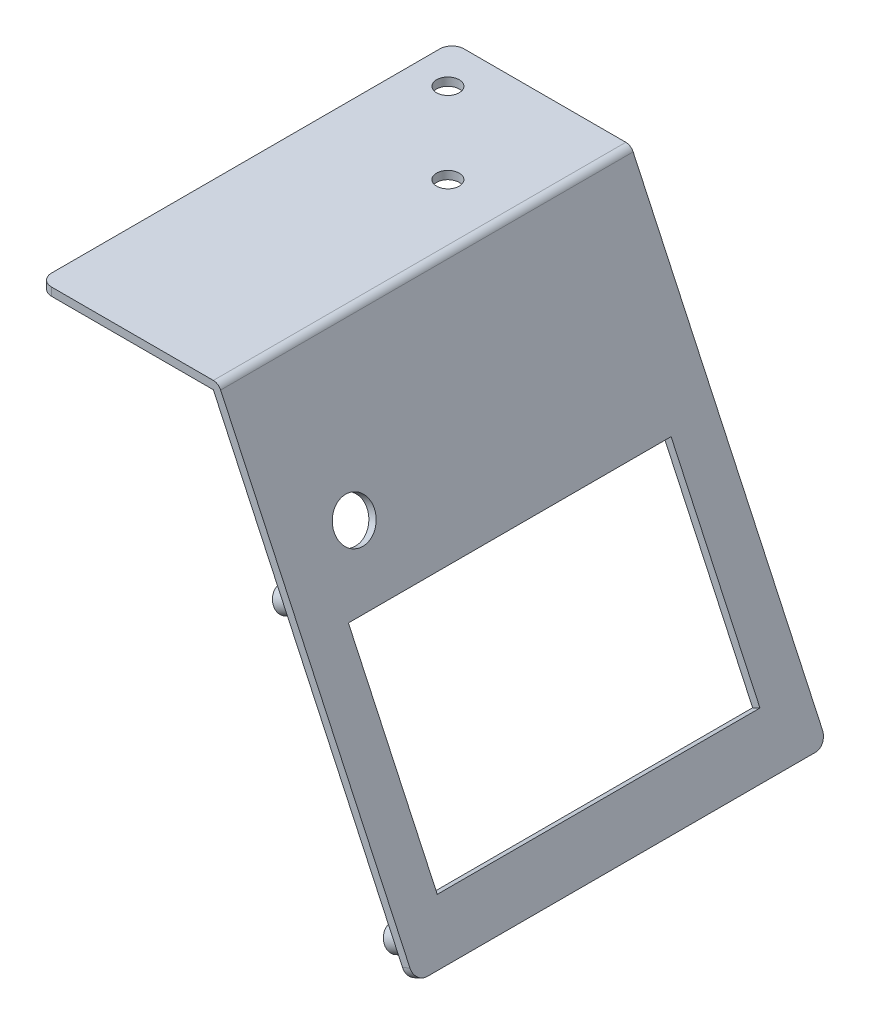
ISO-10303-21;
HEADER;
FILE_DESCRIPTION(('STEP AP214'),'2;1');
FILE_NAME('part.step','',(''),(''),'','','');
FILE_SCHEMA(('AUTOMOTIVE_DESIGN { 1 0 10303 214 1 1 1 1 }'));
ENDSEC;
DATA;
#1=APPLICATION_CONTEXT('core data for automotive mechanical design processes');
#2=APPLICATION_PROTOCOL_DEFINITION('international standard','automotive_design',2000,#1);
#3=PRODUCT_CONTEXT('',#1,'mechanical');
#4=PRODUCT('Part','Part','',(#3));
#5=PRODUCT_RELATED_PRODUCT_CATEGORY('part','',(#4));
#6=PRODUCT_DEFINITION_FORMATION('','',#4);
#7=PRODUCT_DEFINITION_CONTEXT('part definition',#1,'design');
#8=PRODUCT_DEFINITION('design','',#6,#7);
#9=PRODUCT_DEFINITION_SHAPE('','',#8);
#10=(LENGTH_UNIT() NAMED_UNIT(*) SI_UNIT(.MILLI.,.METRE.));
#11=(NAMED_UNIT(*) PLANE_ANGLE_UNIT() SI_UNIT($,.RADIAN.));
#12=(NAMED_UNIT(*) SI_UNIT($,.STERADIAN.) SOLID_ANGLE_UNIT());
#13=UNCERTAINTY_MEASURE_WITH_UNIT(LENGTH_MEASURE(1.E-05),#10,'distance_accuracy_value','');
#14=(GEOMETRIC_REPRESENTATION_CONTEXT(3) GLOBAL_UNCERTAINTY_ASSIGNED_CONTEXT((#13)) GLOBAL_UNIT_ASSIGNED_CONTEXT((#10,
#11,#12)) REPRESENTATION_CONTEXT('',''));
#15=CARTESIAN_POINT('',(0.,0.,0.));
#16=DIRECTION('',(0.,0.,1.));
#17=DIRECTION('',(1.,0.,0.));
#18=AXIS2_PLACEMENT_3D('',#15,#16,#17);
#19=CARTESIAN_POINT('',(92.8752406217959,-104.225395509215,102.));
#20=DIRECTION('',(0.422618261740697,-0.906307787036651,0.));
#21=DIRECTION('',(0.906307787036651,0.422618261740697,0.));
#22=AXIS2_PLACEMENT_3D('',#19,#20,#21);
#23=PLANE('',#22);
#24=DIRECTION('',(0.,0.,-1.));
#25=VECTOR('',#24,1.);
#26=CARTESIAN_POINT('',(92.8752406217959,-104.225395509215,102.));
#27=LINE('',#26,#25);
#28=CARTESIAN_POINT('',(92.8752406217959,-104.225395509215,99.));
#29=VERTEX_POINT('',#28);
#30=CARTESIAN_POINT('',(92.8752406217959,-104.225395509215,3.));
#31=VERTEX_POINT('',#30);
#32=EDGE_CURVE('E196',#29,#31,#27,.T.);
#33=ORIENTED_EDGE('',*,*,#32,.F.);
#34=DIRECTION('',(-0.906307787036651,-0.422618261740697,0.));
#35=VECTOR('',#34,1.);
#36=CARTESIAN_POINT('',(91.0626250477226,-105.070632032696,99.));
#37=LINE('',#36,#35);
#38=CARTESIAN_POINT('',(91.0626250477226,-105.070632032696,99.));
#39=VERTEX_POINT('',#38);
#40=EDGE_CURVE('E239',#29,#39,#37,.T.);
#41=ORIENTED_EDGE('',*,*,#40,.T.);
#42=DIRECTION('',(0.,0.,-1.));
#43=VECTOR('',#42,1.);
#44=CARTESIAN_POINT('',(91.0626250477226,-105.070632032696,102.));
#45=LINE('',#44,#43);
#46=CARTESIAN_POINT('',(91.0626250477226,-105.070632032696,3.));
#47=VERTEX_POINT('',#46);
#48=EDGE_CURVE('E187',#39,#47,#45,.T.);
#49=ORIENTED_EDGE('',*,*,#48,.T.);
#50=DIRECTION('',(-0.906307787036651,-0.422618261740697,0.));
#51=VECTOR('',#50,1.);
#52=CARTESIAN_POINT('',(92.8752406217959,-104.225395509215,3.));
#53=LINE('',#52,#51);
#54=EDGE_CURVE('E237',#47,#31,#53,.F.);
#55=ORIENTED_EDGE('',*,*,#54,.T.);
#56=EDGE_LOOP('',(#33,#41,#49,#55));
#57=FACE_BOUND('',#56,.T.);
#58=ADVANCED_FACE('F34',(#57),#23,.T.);
#59=CARTESIAN_POINT('',(44.2741405216157,3.70279042205781E-13,102.));
#60=DIRECTION('',(0.906307787036651,0.422618261740697,0.));
#61=DIRECTION('',(-0.422618261740697,0.906307787036651,0.));
#62=AXIS2_PLACEMENT_3D('',#59,#60,#61);
#63=PLANE('',#62);
#64=CARTESIAN_POINT('',(58.9366830246469,-31.4439238700159,83.1));
#65=DIRECTION('',(0.906307787036651,0.422618261740697,0.));
#66=DIRECTION('',(-0.422618261740697,0.906307787036651,0.));
#67=AXIS2_PLACEMENT_3D('',#64,#65,#66);
#68=CIRCLE('',#67,4.99999999999998);
#69=CARTESIAN_POINT('',(56.8235917159435,-26.9123849348326,83.1));
#70=VERTEX_POINT('',#69);
#71=EDGE_CURVE('E375',#70,#70,#68,.T.);
#72=ORIENTED_EDGE('',*,*,#71,.F.);
#73=EDGE_LOOP('',(#72));
#74=FACE_BOUND('',#73,.T.);
#75=DIRECTION('',(-0.422618261740704,0.906307787036648,0.));
#76=VECTOR('',#75,1.);
#77=CARTESIAN_POINT('',(87.6747248230152,-93.0728533885078,11.5000000000001));
#78=LINE('',#77,#76);
#79=CARTESIAN_POINT('',(87.6747248230152,-93.0728533885078,11.5000000000001));
#80=VERTEX_POINT('',#79);
#81=CARTESIAN_POINT('',(65.6985752124981,-45.9448484626023,11.5000000000001));
#82=VERTEX_POINT('',#81);
#83=EDGE_CURVE('E162',#80,#82,#78,.T.);
#84=ORIENTED_EDGE('',*,*,#83,.F.);
#85=DIRECTION('',(0.,0.,-1.));
#86=VECTOR('',#85,1.);
#87=CARTESIAN_POINT('',(87.6747248230152,-93.0728533885077,91.3));
#88=LINE('',#87,#86);
#89=CARTESIAN_POINT('',(87.6747248230152,-93.0728533885077,91.3));
#90=VERTEX_POINT('',#89);
#91=EDGE_CURVE('E167',#90,#80,#88,.T.);
#92=ORIENTED_EDGE('',*,*,#91,.F.);
#93=DIRECTION('',(0.422618261740704,-0.906307787036648,0.));
#94=VECTOR('',#93,1.);
#95=CARTESIAN_POINT('',(65.6985752124986,-45.944848462602,91.3));
#96=LINE('',#95,#94);
#97=CARTESIAN_POINT('',(65.6985752124986,-45.944848462602,91.3));
#98=VERTEX_POINT('',#97);
#99=EDGE_CURVE('E146',#98,#90,#96,.T.);
#100=ORIENTED_EDGE('',*,*,#99,.F.);
#101=DIRECTION('',(0.,0.,1.));
#102=VECTOR('',#101,1.);
#103=CARTESIAN_POINT('',(65.6985752124986,-45.944848462602,11.5000000000001));
#104=LINE('',#103,#102);
#105=EDGE_CURVE('E157',#82,#98,#104,.T.);
#106=ORIENTED_EDGE('',*,*,#105,.F.);
#107=EDGE_LOOP('',(#84,#92,#100,#106));
#108=FACE_BOUND('',#107,.T.);
#109=DIRECTION('',(0.422618261740697,-0.906307787036651,0.));
#110=VECTOR('',#109,1.);
#111=CARTESIAN_POINT('',(44.2741405216157,3.70279042205781E-13,102.));
#112=LINE('',#111,#110);
#113=CARTESIAN_POINT('',(44.812615574074,-1.15476347651825,102.));
#114=VERTEX_POINT('',#113);
#115=CARTESIAN_POINT('',(91.6073858365738,-101.506472148105,102.));
#116=VERTEX_POINT('',#115);
#117=EDGE_CURVE('E184',#114,#116,#112,.T.);
#118=ORIENTED_EDGE('',*,*,#117,.T.);
#119=CARTESIAN_POINT('',(91.6073858365738,-101.506472148105,99.));
#120=DIRECTION('',(0.906307787036651,0.422618261740697,0.));
#121=DIRECTION('',(-0.422618261740697,0.906307787036651,0.));
#122=AXIS2_PLACEMENT_3D('',#119,#120,#121);
#123=CIRCLE('',#122,3.);
#124=EDGE_CURVE('E252',#116,#29,#123,.T.);
#125=ORIENTED_EDGE('',*,*,#124,.T.);
#126=ORIENTED_EDGE('',*,*,#32,.T.);
#127=CARTESIAN_POINT('',(91.6073858365738,-101.506472148105,3.));
#128=DIRECTION('',(0.906307787036651,0.422618261740697,0.));
#129=DIRECTION('',(-0.422618261740697,0.906307787036651,0.));
#130=AXIS2_PLACEMENT_3D('',#127,#128,#129);
#131=CIRCLE('',#130,3.);
#132=CARTESIAN_POINT('',(91.6073858365738,-101.506472148105,0.));
#133=VERTEX_POINT('',#132);
#134=EDGE_CURVE('E250',#31,#133,#131,.T.);
#135=ORIENTED_EDGE('',*,*,#134,.T.);
#136=DIRECTION('',(0.422618261740697,-0.906307787036651,0.));
#137=VECTOR('',#136,1.);
#138=CARTESIAN_POINT('',(44.2741405216157,3.70279042205781E-13,0.));
#139=LINE('',#138,#137);
#140=CARTESIAN_POINT('',(44.812615574074,-1.15476347651825,0.));
#141=VERTEX_POINT('',#140);
#142=EDGE_CURVE('E180',#141,#133,#139,.T.);
#143=ORIENTED_EDGE('',*,*,#142,.F.);
#144=DIRECTION('',(0.,0.,-1.));
#145=VECTOR('',#144,1.);
#146=CARTESIAN_POINT('',(44.812615574074,-1.15476347651825,102.));
#147=LINE('',#146,#145);
#148=EDGE_CURVE('E232',#141,#114,#147,.F.);
#149=ORIENTED_EDGE('',*,*,#148,.T.);
#150=EDGE_LOOP('',(#118,#125,#126,#135,#143,#149));
#151=FACE_BOUND('',#150,.T.);
#152=ADVANCED_FACE('F164',(#74,#108,#151),#63,.T.);
#153=CARTESIAN_POINT('',(0.,0.,102.));
#154=DIRECTION('',(0.,1.,0.));
#155=DIRECTION('',(-1.,0.,0.));
#156=AXIS2_PLACEMENT_3D('',#153,#154,#155);
#157=PLANE('',#156);
#158=CARTESIAN_POINT('',(28.9999999999989,0.,29.9999999999999));
#159=DIRECTION('',(0.,-1.,0.));
#160=DIRECTION('',(0.,0.,-1.));
#161=AXIS2_PLACEMENT_3D('',#158,#159,#160);
#162=CIRCLE('',#161,2.80000000000105);
#163=CARTESIAN_POINT('',(28.9999999999989,0.,27.1999999999988));
#164=VERTEX_POINT('',#163);
#165=EDGE_CURVE('E385',#164,#164,#162,.T.);
#166=ORIENTED_EDGE('',*,*,#165,.T.);
#167=EDGE_LOOP('',(#166));
#168=FACE_BOUND('',#167,.T.);
#169=CARTESIAN_POINT('',(8.9999999999989,0.,9.99999999999991));
#170=DIRECTION('',(0.,-1.,0.));
#171=DIRECTION('',(0.,0.,-1.));
#172=AXIS2_PLACEMENT_3D('',#169,#170,#171);
#173=CIRCLE('',#172,2.80000000000105);
#174=CARTESIAN_POINT('',(8.9999999999989,0.,7.19999999999886));
#175=VERTEX_POINT('',#174);
#176=EDGE_CURVE('E379',#175,#175,#173,.T.);
#177=ORIENTED_EDGE('',*,*,#176,.T.);
#178=EDGE_LOOP('',(#177));
#179=FACE_BOUND('',#178,.T.);
#180=DIRECTION('',(1.,0.,0.));
#181=VECTOR('',#180,1.);
#182=CARTESIAN_POINT('',(0.,0.,0.));
#183=LINE('',#182,#181);
#184=CARTESIAN_POINT('',(3.,0.,0.));
#185=VERTEX_POINT('',#184);
#186=CARTESIAN_POINT('',(43.0000000000007,3.59622990469467E-13,0.));
#187=VERTEX_POINT('',#186);
#188=EDGE_CURVE('E192',#185,#187,#183,.T.);
#189=ORIENTED_EDGE('',*,*,#188,.F.);
#190=CARTESIAN_POINT('',(3.,0.,3.));
#191=DIRECTION('',(0.,1.,0.));
#192=DIRECTION('',(-1.,0.,0.));
#193=AXIS2_PLACEMENT_3D('',#190,#191,#192);
#194=CIRCLE('',#193,3.);
#195=CARTESIAN_POINT('',(0.,0.,3.));
#196=VERTEX_POINT('',#195);
#197=EDGE_CURVE('E262',#185,#196,#194,.T.);
#198=ORIENTED_EDGE('',*,*,#197,.T.);
#199=DIRECTION('',(0.,0.,-1.));
#200=VECTOR('',#199,1.);
#201=CARTESIAN_POINT('',(0.,0.,102.));
#202=LINE('',#201,#200);
#203=CARTESIAN_POINT('',(0.,0.,99.));
#204=VERTEX_POINT('',#203);
#205=EDGE_CURVE('E200',#204,#196,#202,.T.);
#206=ORIENTED_EDGE('',*,*,#205,.F.);
#207=CARTESIAN_POINT('',(3.,0.,99.));
#208=DIRECTION('',(0.,1.,0.));
#209=DIRECTION('',(-1.,0.,0.));
#210=AXIS2_PLACEMENT_3D('',#207,#208,#209);
#211=CIRCLE('',#210,3.);
#212=CARTESIAN_POINT('',(3.,0.,102.));
#213=VERTEX_POINT('',#212);
#214=EDGE_CURVE('E260',#204,#213,#211,.T.);
#215=ORIENTED_EDGE('',*,*,#214,.T.);
#216=DIRECTION('',(1.,0.,0.));
#217=VECTOR('',#216,1.);
#218=CARTESIAN_POINT('',(0.,0.,102.));
#219=LINE('',#218,#217);
#220=CARTESIAN_POINT('',(43.0000000000007,3.59622990469467E-13,102.));
#221=VERTEX_POINT('',#220);
#222=EDGE_CURVE('E182',#213,#221,#219,.T.);
#223=ORIENTED_EDGE('',*,*,#222,.T.);
#224=DIRECTION('',(0.,0.,-1.));
#225=VECTOR('',#224,1.);
#226=CARTESIAN_POINT('',(43.0000000000007,3.59622990469467E-13,102.));
#227=LINE('',#226,#225);
#228=EDGE_CURVE('E227',#221,#187,#227,.T.);
#229=ORIENTED_EDGE('',*,*,#228,.T.);
#230=EDGE_LOOP('',(#189,#198,#206,#215,#223,#229));
#231=FACE_BOUND('',#230,.T.);
#232=ADVANCED_FACE('F273',(#168,#179,#231),#157,.T.);
#233=CARTESIAN_POINT('',(0.,-2.,102.));
#234=DIRECTION('',(-1.,0.,0.));
#235=DIRECTION('',(0.,0.,1.));
#236=AXIS2_PLACEMENT_3D('',#233,#234,#235);
#237=PLANE('',#236);
#238=ORIENTED_EDGE('',*,*,#205,.T.);
#239=DIRECTION('',(0.,1.,0.));
#240=VECTOR('',#239,1.);
#241=CARTESIAN_POINT('',(0.,-2.,3.));
#242=LINE('',#241,#240);
#243=CARTESIAN_POINT('',(0.,-2.,3.));
#244=VERTEX_POINT('',#243);
#245=EDGE_CURVE('E49',#196,#244,#242,.F.);
#246=ORIENTED_EDGE('',*,*,#245,.T.);
#247=DIRECTION('',(0.,0.,-1.));
#248=VECTOR('',#247,1.);
#249=CARTESIAN_POINT('',(0.,-2.,102.));
#250=LINE('',#249,#248);
#251=CARTESIAN_POINT('',(0.,-2.,99.));
#252=VERTEX_POINT('',#251);
#253=EDGE_CURVE('E202',#252,#244,#250,.T.);
#254=ORIENTED_EDGE('',*,*,#253,.F.);
#255=DIRECTION('',(0.,1.,0.));
#256=VECTOR('',#255,1.);
#257=CARTESIAN_POINT('',(0.,0.,99.));
#258=LINE('',#257,#256);
#259=EDGE_CURVE('E264',#252,#204,#258,.T.);
#260=ORIENTED_EDGE('',*,*,#259,.T.);
#261=EDGE_LOOP('',(#238,#246,#254,#260));
#262=FACE_BOUND('',#261,.T.);
#263=ADVANCED_FACE('F269',(#262),#237,.T.);
#264=CARTESIAN_POINT('',(43.0000000000008,-1.99999999999965,102.));
#265=DIRECTION('',(0.,-1.,0.));
#266=DIRECTION('',(1.,0.,0.));
#267=AXIS2_PLACEMENT_3D('',#264,#265,#266);
#268=PLANE('',#267);
#269=CARTESIAN_POINT('',(28.9999999999989,-2.,29.9999999999999));
#270=DIRECTION('',(0.,-1.,0.));
#271=DIRECTION('',(0.,0.,-1.));
#272=AXIS2_PLACEMENT_3D('',#269,#270,#271);
#273=CIRCLE('',#272,2.80000000000105);
#274=CARTESIAN_POINT('',(28.9999999999989,-2.,27.1999999999988));
#275=VERTEX_POINT('',#274);
#276=EDGE_CURVE('E388',#275,#275,#273,.T.);
#277=ORIENTED_EDGE('',*,*,#276,.F.);
#278=EDGE_LOOP('',(#277));
#279=FACE_BOUND('',#278,.T.);
#280=CARTESIAN_POINT('',(8.9999999999989,-2.,9.99999999999991));
#281=DIRECTION('',(0.,-1.,0.));
#282=DIRECTION('',(0.,0.,-1.));
#283=AXIS2_PLACEMENT_3D('',#280,#281,#282);
#284=CIRCLE('',#283,2.80000000000105);
#285=CARTESIAN_POINT('',(8.9999999999989,-2.,7.19999999999886));
#286=VERTEX_POINT('',#285);
#287=EDGE_CURVE('E382',#286,#286,#284,.T.);
#288=ORIENTED_EDGE('',*,*,#287,.F.);
#289=EDGE_LOOP('',(#288));
#290=FACE_BOUND('',#289,.T.);
#291=ORIENTED_EDGE('',*,*,#253,.T.);
#292=CARTESIAN_POINT('',(3.,-1.99999999999998,3.));
#293=DIRECTION('',(0.,-1.,0.));
#294=DIRECTION('',(1.,0.,0.));
#295=AXIS2_PLACEMENT_3D('',#292,#293,#294);
#296=CIRCLE('',#295,3.);
#297=CARTESIAN_POINT('',(3.,-1.99999999999998,0.));
#298=VERTEX_POINT('',#297);
#299=EDGE_CURVE('E11',#244,#298,#296,.T.);
#300=ORIENTED_EDGE('',*,*,#299,.T.);
#301=DIRECTION('',(-1.,0.,0.));
#302=VECTOR('',#301,1.);
#303=CARTESIAN_POINT('',(43.0000000000008,-1.99999999999965,0.));
#304=LINE('',#303,#302);
#305=CARTESIAN_POINT('',(43.0000000000008,-1.99999999999965,0.));
#306=VERTEX_POINT('',#305);
#307=EDGE_CURVE('E189',#306,#298,#304,.T.);
#308=ORIENTED_EDGE('',*,*,#307,.F.);
#309=DIRECTION('',(0.,0.,-1.));
#310=VECTOR('',#309,1.);
#311=CARTESIAN_POINT('',(43.0000000000008,-1.99999999999965,102.));
#312=LINE('',#311,#310);
#313=CARTESIAN_POINT('',(43.0000000000008,-1.99999999999965,102.));
#314=VERTEX_POINT('',#313);
#315=EDGE_CURVE('E204',#314,#306,#312,.T.);
#316=ORIENTED_EDGE('',*,*,#315,.F.);
#317=DIRECTION('',(-1.,0.,0.));
#318=VECTOR('',#317,1.);
#319=CARTESIAN_POINT('',(43.0000000000008,-1.99999999999965,102.));
#320=LINE('',#319,#318);
#321=CARTESIAN_POINT('',(3.,-1.99999999999998,102.));
#322=VERTEX_POINT('',#321);
#323=EDGE_CURVE('E179',#314,#322,#320,.T.);
#324=ORIENTED_EDGE('',*,*,#323,.T.);
#325=CARTESIAN_POINT('',(3.,-1.99999999999998,99.));
#326=DIRECTION('',(0.,-1.,0.));
#327=DIRECTION('',(1.,0.,0.));
#328=AXIS2_PLACEMENT_3D('',#325,#326,#327);
#329=CIRCLE('',#328,3.);
#330=EDGE_CURVE('E42',#322,#252,#329,.T.);
#331=ORIENTED_EDGE('',*,*,#330,.T.);
#332=EDGE_LOOP('',(#291,#300,#308,#316,#324,#331));
#333=FACE_BOUND('',#332,.T.);
#334=ADVANCED_FACE('F285',(#279,#290,#333),#268,.T.);
#335=CARTESIAN_POINT('',(91.0626250477226,-105.070632032696,102.));
#336=DIRECTION('',(-0.906307787036651,-0.422618261740697,0.));
#337=DIRECTION('',(0.422618261740697,-0.906307787036651,0.));
#338=AXIS2_PLACEMENT_3D('',#335,#336,#337);
#339=PLANE('',#338);
#340=CARTESIAN_POINT('',(57.1240674505741,-32.2891603934971,83.1));
#341=DIRECTION('',(-0.906307787036648,-0.422618261740704,0.));
#342=DIRECTION('',(0.422618261740704,-0.906307787036648,0.));
#343=AXIS2_PLACEMENT_3D('',#340,#341,#342);
#344=CIRCLE('',#343,4.99999999999999);
#345=CARTESIAN_POINT('',(59.2371587592776,-36.8206993286803,83.1));
#346=VERTEX_POINT('',#345);
#347=EDGE_CURVE('E346',#346,#346,#344,.T.);
#348=ORIENTED_EDGE('',*,*,#347,.F.);
#349=EDGE_LOOP('',(#348));
#350=FACE_BOUND('',#349,.T.);
#351=CARTESIAN_POINT('',(61.1600718501972,-40.944399759697,8.04999999999999));
#352=DIRECTION('',(-0.906307787036651,-0.422618261740697,0.));
#353=DIRECTION('',(0.422618261740697,-0.906307787036651,0.));
#354=AXIS2_PLACEMENT_3D('',#351,#352,#353);
#355=CIRCLE('',#354,3.00000000000001);
#356=CARTESIAN_POINT('',(62.4279266354193,-43.6633231208069,8.04999999999999));
#357=VERTEX_POINT('',#356);
#358=EDGE_CURVE('E224',#357,#357,#355,.T.);
#359=ORIENTED_EDGE('',*,*,#358,.F.);
#360=EDGE_LOOP('',(#359));
#361=FACE_BOUND('',#360,.T.);
#362=CARTESIAN_POINT('',(88.5879970371684,-99.7637751383756,8.04999999999999));
#363=DIRECTION('',(-0.906307787036651,-0.422618261740697,0.));
#364=DIRECTION('',(0.422618261740697,-0.906307787036651,0.));
#365=AXIS2_PLACEMENT_3D('',#362,#363,#364);
#366=CIRCLE('',#365,2.99999999999999);
#367=CARTESIAN_POINT('',(87.3201422519463,-97.0448517772657,8.04999999999999));
#368=VERTEX_POINT('',#367);
#369=EDGE_CURVE('E221',#368,#368,#366,.T.);
#370=ORIENTED_EDGE('',*,*,#369,.F.);
#371=EDGE_LOOP('',(#370));
#372=FACE_BOUND('',#371,.T.);
#373=CARTESIAN_POINT('',(88.5879970371684,-99.7637751383756,95.95));
#374=DIRECTION('',(-0.906307787036651,-0.422618261740697,0.));
#375=DIRECTION('',(0.422618261740697,-0.906307787036651,0.));
#376=AXIS2_PLACEMENT_3D('',#373,#374,#375);
#377=CIRCLE('',#376,2.99999999999999);
#378=CARTESIAN_POINT('',(89.8558518223905,-102.482698499486,95.95));
#379=VERTEX_POINT('',#378);
#380=EDGE_CURVE('E218',#379,#379,#377,.T.);
#381=ORIENTED_EDGE('',*,*,#380,.F.);
#382=EDGE_LOOP('',(#381));
#383=FACE_BOUND('',#382,.T.);
#384=CARTESIAN_POINT('',(61.1600718501972,-40.944399759697,95.95));
#385=DIRECTION('',(-0.906307787036651,-0.422618261740697,0.));
#386=DIRECTION('',(0.422618261740697,-0.906307787036651,0.));
#387=AXIS2_PLACEMENT_3D('',#384,#385,#386);
#388=CIRCLE('',#387,3.00000000000001);
#389=CARTESIAN_POINT('',(62.4279266354193,-43.6633231208069,95.95));
#390=VERTEX_POINT('',#389);
#391=EDGE_CURVE('E215',#390,#390,#388,.T.);
#392=ORIENTED_EDGE('',*,*,#391,.F.);
#393=EDGE_LOOP('',(#392));
#394=FACE_BOUND('',#393,.T.);
#395=DIRECTION('',(0.422618261740697,-0.906307787036651,0.));
#396=VECTOR('',#395,1.);
#397=CARTESIAN_POINT('',(91.0626250477226,-105.070632032696,11.5000000000001));
#398=LINE('',#397,#396);
#399=CARTESIAN_POINT('',(63.8859596384248,-46.7900849860837,11.5000000000001));
#400=VERTEX_POINT('',#399);
#401=CARTESIAN_POINT('',(85.8621092489411,-93.9180899119896,11.5000000000001));
#402=VERTEX_POINT('',#401);
#403=EDGE_CURVE('E213',#400,#402,#398,.T.);
#404=ORIENTED_EDGE('',*,*,#403,.F.);
#405=DIRECTION('',(0.,0.,-1.));
#406=VECTOR('',#405,1.);
#407=CARTESIAN_POINT('',(63.8859596384248,-46.7900849860837,102.));
#408=LINE('',#407,#406);
#409=CARTESIAN_POINT('',(63.8859596384248,-46.7900849860837,91.3));
#410=VERTEX_POINT('',#409);
#411=EDGE_CURVE('E199',#410,#400,#408,.T.);
#412=ORIENTED_EDGE('',*,*,#411,.F.);
#413=DIRECTION('',(-0.422618261740697,0.906307787036651,0.));
#414=VECTOR('',#413,1.);
#415=CARTESIAN_POINT('',(91.0626250477226,-105.070632032696,91.3));
#416=LINE('',#415,#414);
#417=CARTESIAN_POINT('',(85.8621092489411,-93.9180899119896,91.3));
#418=VERTEX_POINT('',#417);
#419=EDGE_CURVE('E149',#418,#410,#416,.T.);
#420=ORIENTED_EDGE('',*,*,#419,.F.);
#421=DIRECTION('',(0.,0.,1.));
#422=VECTOR('',#421,1.);
#423=CARTESIAN_POINT('',(85.8621092489411,-93.9180899119896,102.));
#424=LINE('',#423,#422);
#425=EDGE_CURVE('E211',#402,#418,#424,.T.);
#426=ORIENTED_EDGE('',*,*,#425,.F.);
#427=EDGE_LOOP('',(#404,#412,#420,#426));
#428=FACE_BOUND('',#427,.T.);
#429=ORIENTED_EDGE('',*,*,#48,.F.);
#430=CARTESIAN_POINT('',(89.7947702625005,-102.351708671586,99.));
#431=DIRECTION('',(-0.906307787036651,-0.422618261740697,0.));
#432=DIRECTION('',(0.422618261740697,-0.906307787036651,0.));
#433=AXIS2_PLACEMENT_3D('',#430,#431,#432);
#434=CIRCLE('',#433,3.);
#435=CARTESIAN_POINT('',(89.7947702625005,-102.351708671586,102.));
#436=VERTEX_POINT('',#435);
#437=EDGE_CURVE('E244',#39,#436,#434,.T.);
#438=ORIENTED_EDGE('',*,*,#437,.T.);
#439=DIRECTION('',(-0.422618261740697,0.906307787036651,0.));
#440=VECTOR('',#439,1.);
#441=CARTESIAN_POINT('',(91.0626250477226,-105.070632032696,102.));
#442=LINE('',#441,#440);
#443=EDGE_CURVE('E177',#436,#314,#442,.T.);
#444=ORIENTED_EDGE('',*,*,#443,.T.);
#445=ORIENTED_EDGE('',*,*,#315,.T.);
#446=DIRECTION('',(-0.422618261740697,0.906307787036651,0.));
#447=VECTOR('',#446,1.);
#448=CARTESIAN_POINT('',(91.0626250477226,-105.070632032696,0.));
#449=LINE('',#448,#447);
#450=CARTESIAN_POINT('',(89.7947702625005,-102.351708671586,0.));
#451=VERTEX_POINT('',#450);
#452=EDGE_CURVE('E174',#451,#306,#449,.T.);
#453=ORIENTED_EDGE('',*,*,#452,.F.);
#454=CARTESIAN_POINT('',(89.7947702625005,-102.351708671586,3.));
#455=DIRECTION('',(-0.906307787036651,-0.422618261740697,0.));
#456=DIRECTION('',(0.422618261740697,-0.906307787036651,0.));
#457=AXIS2_PLACEMENT_3D('',#454,#455,#456);
#458=CIRCLE('',#457,3.);
#459=EDGE_CURVE('E242',#451,#47,#458,.T.);
#460=ORIENTED_EDGE('',*,*,#459,.T.);
#461=EDGE_LOOP('',(#429,#438,#444,#445,#453,#460));
#462=FACE_BOUND('',#461,.T.);
#463=ADVANCED_FACE('F313',(#350,#361,#372,#383,#394,#428,#462),#339,.T.);
#464=CARTESIAN_POINT('',(0.,0.,102.));
#465=DIRECTION('',(0.,0.,-1.));
#466=DIRECTION('',(-1.,0.,0.));
#467=AXIS2_PLACEMENT_3D('',#464,#465,#466);
#468=PLANE('',#467);
#469=ORIENTED_EDGE('',*,*,#443,.F.);
#470=DIRECTION('',(-0.906307787036651,-0.422618261740697,0.));
#471=VECTOR('',#470,1.);
#472=CARTESIAN_POINT('',(91.6073858365738,-101.506472148105,102.));
#473=LINE('',#472,#471);
#474=EDGE_CURVE('E248',#436,#116,#473,.F.);
#475=ORIENTED_EDGE('',*,*,#474,.T.);
#476=ORIENTED_EDGE('',*,*,#117,.F.);
#477=CARTESIAN_POINT('',(43.0000000000007,-1.99999999999964,102.));
#478=DIRECTION('',(0.,0.,-1.));
#479=DIRECTION('',(-1.,0.,0.));
#480=AXIS2_PLACEMENT_3D('',#477,#478,#479);
#481=CIRCLE('',#480,2.);
#482=EDGE_CURVE('E234',#114,#221,#481,.F.);
#483=ORIENTED_EDGE('',*,*,#482,.T.);
#484=ORIENTED_EDGE('',*,*,#222,.F.);
#485=DIRECTION('',(0.,1.,0.));
#486=VECTOR('',#485,1.);
#487=CARTESIAN_POINT('',(3.,-2.,102.));
#488=LINE('',#487,#486);
#489=EDGE_CURVE('E246',#213,#322,#488,.F.);
#490=ORIENTED_EDGE('',*,*,#489,.T.);
#491=ORIENTED_EDGE('',*,*,#323,.F.);
#492=EDGE_LOOP('',(#469,#475,#476,#483,#484,#490,#491));
#493=FACE_BOUND('',#492,.T.);
#494=ADVANCED_FACE('F290',(#493),#468,.F.);
#495=CARTESIAN_POINT('',(0.,0.,0.));
#496=DIRECTION('',(0.,0.,-1.));
#497=DIRECTION('',(-1.,0.,0.));
#498=AXIS2_PLACEMENT_3D('',#495,#496,#497);
#499=PLANE('',#498);
#500=ORIENTED_EDGE('',*,*,#307,.T.);
#501=DIRECTION('',(0.,1.,0.));
#502=VECTOR('',#501,1.);
#503=CARTESIAN_POINT('',(3.,0.,0.));
#504=LINE('',#503,#502);
#505=EDGE_CURVE('E257',#298,#185,#504,.T.);
#506=ORIENTED_EDGE('',*,*,#505,.T.);
#507=ORIENTED_EDGE('',*,*,#188,.T.);
#508=CARTESIAN_POINT('',(43.0000000000007,-1.99999999999964,0.));
#509=DIRECTION('',(0.,0.,-1.));
#510=DIRECTION('',(-1.,0.,0.));
#511=AXIS2_PLACEMENT_3D('',#508,#509,#510);
#512=CIRCLE('',#511,2.);
#513=EDGE_CURVE('E230',#187,#141,#512,.T.);
#514=ORIENTED_EDGE('',*,*,#513,.T.);
#515=ORIENTED_EDGE('',*,*,#142,.T.);
#516=DIRECTION('',(-0.906307787036651,-0.422618261740697,0.));
#517=VECTOR('',#516,1.);
#518=CARTESIAN_POINT('',(55.2408810973581,-118.464451808331,0.));
#519=LINE('',#518,#517);
#520=EDGE_CURVE('E254',#133,#451,#519,.T.);
#521=ORIENTED_EDGE('',*,*,#520,.T.);
#522=ORIENTED_EDGE('',*,*,#452,.T.);
#523=EDGE_LOOP('',(#500,#506,#507,#514,#515,#521,#522));
#524=FACE_BOUND('',#523,.T.);
#525=ADVANCED_FACE('F280',(#524),#499,.T.);
#526=CARTESIAN_POINT('',(11.0638331819764,-128.797098858807,11.5000000000001));
#527=DIRECTION('',(0.,0.,-1.));
#528=DIRECTION('',(0.,1.,0.));
#529=AXIS2_PLACEMENT_3D('',#526,#527,#528);
#530=PLANE('',#529);
#531=ORIENTED_EDGE('',*,*,#403,.T.);
#532=DIRECTION('',(0.906307787036648,0.422618261740704,0.));
#533=VECTOR('',#532,1.);
#534=CARTESIAN_POINT('',(11.0638331819764,-128.797098858807,11.5000000000001));
#535=LINE('',#534,#533);
#536=EDGE_CURVE('E172',#402,#80,#535,.T.);
#537=ORIENTED_EDGE('',*,*,#536,.T.);
#538=ORIENTED_EDGE('',*,*,#83,.T.);
#539=DIRECTION('',(0.906307787036648,0.422618261740704,0.));
#540=VECTOR('',#539,1.);
#541=CARTESIAN_POINT('',(-10.9123164285402,-81.6690939329016,11.5000000000001));
#542=LINE('',#541,#540);
#543=EDGE_CURVE('E153',#400,#82,#542,.T.);
#544=ORIENTED_EDGE('',*,*,#543,.F.);
#545=EDGE_LOOP('',(#531,#537,#538,#544));
#546=FACE_BOUND('',#545,.T.);
#547=ADVANCED_FACE('F359',(#546),#530,.F.);
#548=CARTESIAN_POINT('',(11.0638331819764,-128.797098858807,91.3));
#549=DIRECTION('',(0.422618261740704,-0.906307787036648,0.));
#550=DIRECTION('',(0.906307787036648,0.422618261740704,0.));
#551=AXIS2_PLACEMENT_3D('',#548,#549,#550);
#552=PLANE('',#551);
#553=ORIENTED_EDGE('',*,*,#425,.T.);
#554=DIRECTION('',(0.906307787036648,0.422618261740704,0.));
#555=VECTOR('',#554,1.);
#556=CARTESIAN_POINT('',(11.0638331819764,-128.797098858807,91.3));
#557=LINE('',#556,#555);
#558=EDGE_CURVE('E152',#418,#90,#557,.T.);
#559=ORIENTED_EDGE('',*,*,#558,.T.);
#560=ORIENTED_EDGE('',*,*,#91,.T.);
#561=ORIENTED_EDGE('',*,*,#536,.F.);
#562=EDGE_LOOP('',(#553,#559,#560,#561));
#563=FACE_BOUND('',#562,.T.);
#564=ADVANCED_FACE('F361',(#563),#552,.F.);
#565=CARTESIAN_POINT('',(-10.9123164285402,-81.6690939329016,91.3));
#566=DIRECTION('',(0.,0.,1.));
#567=DIRECTION('',(1.,0.,0.));
#568=AXIS2_PLACEMENT_3D('',#565,#566,#567);
#569=PLANE('',#568);
#570=ORIENTED_EDGE('',*,*,#419,.T.);
#571=DIRECTION('',(0.906307787036648,0.422618261740704,0.));
#572=VECTOR('',#571,1.);
#573=CARTESIAN_POINT('',(-10.9123164285402,-81.6690939329016,91.3));
#574=LINE('',#573,#572);
#575=EDGE_CURVE('E141',#410,#98,#574,.T.);
#576=ORIENTED_EDGE('',*,*,#575,.T.);
#577=ORIENTED_EDGE('',*,*,#99,.T.);
#578=ORIENTED_EDGE('',*,*,#558,.F.);
#579=EDGE_LOOP('',(#570,#576,#577,#578));
#580=FACE_BOUND('',#579,.T.);
#581=ADVANCED_FACE('F143',(#580),#569,.F.);
#582=CARTESIAN_POINT('',(-10.9123164285402,-81.6690939329016,11.5000000000001));
#583=DIRECTION('',(-0.422618261740704,0.906307787036648,0.));
#584=DIRECTION('',(-0.906307787036648,-0.422618261740704,0.));
#585=AXIS2_PLACEMENT_3D('',#582,#583,#584);
#586=PLANE('',#585);
#587=ORIENTED_EDGE('',*,*,#411,.T.);
#588=ORIENTED_EDGE('',*,*,#543,.T.);
#589=ORIENTED_EDGE('',*,*,#105,.T.);
#590=ORIENTED_EDGE('',*,*,#575,.F.);
#591=EDGE_LOOP('',(#587,#588,#589,#590));
#592=FACE_BOUND('',#591,.T.);
#593=ADVANCED_FACE('F158',(#592),#586,.F.);
#594=CARTESIAN_POINT('',(53.7745092749178,-44.3883441483327,95.95));
#595=DIRECTION('',(0.906307787036648,0.422618261740704,0.));
#596=DIRECTION('',(-0.422618261740704,0.906307787036648,0.));
#597=AXIS2_PLACEMENT_3D('',#594,#595,#596);
#598=CYLINDRICAL_SURFACE('',#597,3.00000000000001);
#599=CARTESIAN_POINT('',(54.8159173409402,-43.9027275918821,95.95));
#600=DIRECTION('',(0.906307787036648,0.422618261740704,0.));
#601=DIRECTION('',(-0.422618261740704,0.906307787036648,0.));
#602=AXIS2_PLACEMENT_3D('',#599,#600,#601);
#603=CIRCLE('',#602,3.00000000000001);
#604=CARTESIAN_POINT('',(53.5480625557181,-41.1838042307722,95.95));
#605=VERTEX_POINT('',#604);
#606=EDGE_CURVE('E362',#605,#605,#603,.T.);
#607=ORIENTED_EDGE('',*,*,#606,.T.);
#608=EDGE_LOOP('',(#607));
#609=FACE_BOUND('',#608,.T.);
#610=ORIENTED_EDGE('',*,*,#391,.T.);
#611=EDGE_LOOP('',(#610));
#612=FACE_BOUND('',#611,.T.);
#613=ADVANCED_FACE('F451',(#609,#612),#598,.T.);
#614=CARTESIAN_POINT('',(56.0837721261623,-46.6216509529921,95.95));
#615=DIRECTION('',(-0.906307787036648,-0.422618261740704,0.));
#616=DIRECTION('',(0.422618261740704,-0.906307787036648,0.));
#617=AXIS2_PLACEMENT_3D('',#614,#615,#616);
#618=PLANE('',#617);
#619=CARTESIAN_POINT('',(54.8159173409402,-43.9027275918821,95.95));
#620=DIRECTION('',(-0.906307787036648,-0.422618261740704,0.));
#621=DIRECTION('',(0.422618261740704,-0.906307787036648,0.));
#622=AXIS2_PLACEMENT_3D('',#619,#620,#621);
#623=CIRCLE('',#622,1.34999999999999);
#624=CARTESIAN_POINT('',(55.3864519942901,-45.1262431043816,95.95));
#625=VERTEX_POINT('',#624);
#626=EDGE_CURVE('E394',#625,#625,#623,.T.);
#627=ORIENTED_EDGE('',*,*,#626,.F.);
#628=EDGE_LOOP('',(#627));
#629=FACE_BOUND('',#628,.T.);
#630=ORIENTED_EDGE('',*,*,#606,.F.);
#631=EDGE_LOOP('',(#630));
#632=FACE_BOUND('',#631,.T.);
#633=ADVANCED_FACE('F447',(#629,#632),#618,.T.);
#634=CARTESIAN_POINT('',(81.2024344618895,-103.207719527011,95.95));
#635=DIRECTION('',(0.906307787036648,0.422618261740705,0.));
#636=DIRECTION('',(-0.422618261740705,0.906307787036648,0.));
#637=AXIS2_PLACEMENT_3D('',#634,#635,#636);
#638=CYLINDRICAL_SURFACE('',#637,2.99999999999999);
#639=CARTESIAN_POINT('',(82.2438425279118,-102.722102970561,95.95));
#640=DIRECTION('',(0.906307787036648,0.422618261740705,0.));
#641=DIRECTION('',(-0.422618261740705,0.906307787036648,0.));
#642=AXIS2_PLACEMENT_3D('',#639,#640,#641);
#643=CIRCLE('',#642,2.99999999999999);
#644=CARTESIAN_POINT('',(80.9759877426897,-100.003179609451,95.95));
#645=VERTEX_POINT('',#644);
#646=EDGE_CURVE('E364',#645,#645,#643,.T.);
#647=ORIENTED_EDGE('',*,*,#646,.T.);
#648=EDGE_LOOP('',(#647));
#649=FACE_BOUND('',#648,.T.);
#650=ORIENTED_EDGE('',*,*,#380,.T.);
#651=EDGE_LOOP('',(#650));
#652=FACE_BOUND('',#651,.T.);
#653=ADVANCED_FACE('F443',(#649,#652),#638,.T.);
#654=CARTESIAN_POINT('',(83.511697313134,-105.441026331671,95.95));
#655=DIRECTION('',(-0.906307787036648,-0.422618261740705,0.));
#656=DIRECTION('',(0.422618261740705,-0.906307787036648,0.));
#657=AXIS2_PLACEMENT_3D('',#654,#655,#656);
#658=PLANE('',#657);
#659=CARTESIAN_POINT('',(82.2438425279118,-102.722102970561,95.95));
#660=DIRECTION('',(-0.906307787036648,-0.422618261740704,0.));
#661=DIRECTION('',(0.422618261740704,-0.906307787036648,0.));
#662=AXIS2_PLACEMENT_3D('',#659,#660,#661);
#663=CIRCLE('',#662,1.34999999999999);
#664=CARTESIAN_POINT('',(82.8143771812618,-103.94561848306,95.95));
#665=VERTEX_POINT('',#664);
#666=EDGE_CURVE('E400',#665,#665,#663,.T.);
#667=ORIENTED_EDGE('',*,*,#666,.F.);
#668=EDGE_LOOP('',(#667));
#669=FACE_BOUND('',#668,.T.);
#670=ORIENTED_EDGE('',*,*,#646,.F.);
#671=EDGE_LOOP('',(#670));
#672=FACE_BOUND('',#671,.T.);
#673=ADVANCED_FACE('F439',(#669,#672),#658,.T.);
#674=CARTESIAN_POINT('',(81.2024344618895,-103.207719527011,8.04999999999999));
#675=DIRECTION('',(0.906307787036648,0.422618261740704,0.));
#676=DIRECTION('',(-0.422618261740704,0.906307787036648,0.));
#677=AXIS2_PLACEMENT_3D('',#674,#675,#676);
#678=CYLINDRICAL_SURFACE('',#677,2.99999999999999);
#679=CARTESIAN_POINT('',(82.2438425279118,-102.722102970561,8.04999999999999));
#680=DIRECTION('',(0.906307787036648,0.422618261740704,0.));
#681=DIRECTION('',(-0.422618261740704,0.906307787036648,0.));
#682=AXIS2_PLACEMENT_3D('',#679,#680,#681);
#683=CIRCLE('',#682,2.99999999999999);
#684=CARTESIAN_POINT('',(80.9759877426897,-100.003179609451,8.04999999999999));
#685=VERTEX_POINT('',#684);
#686=EDGE_CURVE('E369',#685,#685,#683,.T.);
#687=CARTESIAN_POINT('',(80.9759877426897,-100.003179609451,8.04999999999999));
#688=CARTESIAN_POINT('',(81.0420726854945,-99.9723636945321,8.04999999999999));
#689=CARTESIAN_POINT('',(81.1081576282993,-99.9415477796135,8.04999999999999));
#690=CARTESIAN_POINT('',(81.2403275139088,-99.8799159497763,8.04999999999999));
#691=CARTESIAN_POINT('',(81.3064124567135,-99.8491000348577,8.04999999999999));
#692=CARTESIAN_POINT('',(81.438582342323,-99.7874682050205,8.04999999999999));
#693=CARTESIAN_POINT('',(81.5046672851278,-99.7566522901019,8.04999999999999));
#694=CARTESIAN_POINT('',(81.6368371707373,-99.6950204602647,8.04999999999999));
#695=CARTESIAN_POINT('',(81.702922113542,-99.6642045453461,8.04999999999999));
#696=CARTESIAN_POINT('',(81.8350919991516,-99.6025727155089,8.04999999999999));
#697=CARTESIAN_POINT('',(81.9011769419563,-99.5717568005903,8.04999999999999));
#698=CARTESIAN_POINT('',(82.0333468275658,-99.5101249707532,8.04999999999999));
#699=CARTESIAN_POINT('',(82.0994317703706,-99.4793090558346,8.04999999999999));
#700=CARTESIAN_POINT('',(82.2316016559801,-99.4176772259974,8.04999999999999));
#701=CARTESIAN_POINT('',(82.2976865987848,-99.3868613110788,8.04999999999999));
#702=CARTESIAN_POINT('',(82.4298564843944,-99.3252294812416,8.04999999999999));
#703=CARTESIAN_POINT('',(82.4959414271991,-99.294413566323,8.04999999999999));
#704=CARTESIAN_POINT('',(82.6281113128086,-99.2327817364858,8.04999999999999));
#705=CARTESIAN_POINT('',(82.6941962556134,-99.2019658215672,8.04999999999999));
#706=CARTESIAN_POINT('',(82.8263661412229,-99.14033399173,8.04999999999999));
#707=CARTESIAN_POINT('',(82.8924510840277,-99.1095180768114,8.04999999999999));
#708=CARTESIAN_POINT('',(83.0246209696372,-99.0478862469743,8.04999999999999));
#709=CARTESIAN_POINT('',(83.0907059124419,-99.0170703320557,8.04999999999999));
#710=CARTESIAN_POINT('',(83.2228757980514,-98.9554385022185,8.04999999999999));
#711=CARTESIAN_POINT('',(83.2889607408562,-98.9246225872999,8.04999999999999));
#712=CARTESIAN_POINT('',(83.4211306264657,-98.8629907574627,8.04999999999999));
#713=CARTESIAN_POINT('',(83.4872155692705,-98.8321748425441,8.04999999999999));
#714=CARTESIAN_POINT('',(83.61938545488,-98.7705430127069,8.04999999999999));
#715=CARTESIAN_POINT('',(83.6854703976847,-98.7397270977883,8.04999999999999));
#716=CARTESIAN_POINT('',(83.8176402832943,-98.6780952679511,8.04999999999999));
#717=CARTESIAN_POINT('',(83.883725226099,-98.6472793530325,8.04999999999999));
#718=CARTESIAN_POINT('',(84.0158951117085,-98.5856475231954,8.04999999999999));
#719=CARTESIAN_POINT('',(84.0819800545133,-98.5548316082768,8.04999999999999));
#720=CARTESIAN_POINT('',(84.2141499401228,-98.4931997784396,8.04999999999999));
#721=CARTESIAN_POINT('',(84.2802348829275,-98.462383863521,8.04999999999999));
#722=CARTESIAN_POINT('',(84.4124047685371,-98.4007520336838,8.04999999999999));
#723=CARTESIAN_POINT('',(84.4784897113418,-98.3699361187652,8.04999999999999));
#724=CARTESIAN_POINT('',(84.6106595969513,-98.308304288928,8.04999999999999));
#725=CARTESIAN_POINT('',(84.6767445397561,-98.2774883740094,8.04999999999999));
#726=CARTESIAN_POINT('',(84.8089144253656,-98.2158565441722,8.04999999999999));
#727=CARTESIAN_POINT('',(84.8749993681704,-98.1850406292536,8.04999999999999));
#728=CARTESIAN_POINT('',(85.0071692537799,-98.1234087994165,8.04999999999999));
#729=CARTESIAN_POINT('',(85.0732541965846,-98.0925928844979,8.04999999999999));
#730=CARTESIAN_POINT('',(85.2054240821941,-98.0309610546607,8.04999999999999));
#731=CARTESIAN_POINT('',(85.2715090249989,-98.0001451397421,8.04999999999999));
#732=CARTESIAN_POINT('',(85.4036789106084,-97.9385133099049,8.04999999999999));
#733=CARTESIAN_POINT('',(85.4697638534132,-97.9076973949863,8.04999999999999));
#734=CARTESIAN_POINT('',(85.6019337390227,-97.8460655651491,8.04999999999999));
#735=CARTESIAN_POINT('',(85.6680186818274,-97.8152496502305,8.04999999999999));
#736=CARTESIAN_POINT('',(85.8001885674369,-97.7536178203933,8.04999999999999));
#737=CARTESIAN_POINT('',(85.8662735102417,-97.7228019054747,8.04999999999999));
#738=CARTESIAN_POINT('',(85.9984433958512,-97.6611700756376,8.04999999999999));
#739=CARTESIAN_POINT('',(86.064528338656,-97.630354160719,8.04999999999999));
#740=CARTESIAN_POINT('',(86.1966982242655,-97.5687223308818,8.04999999999999));
#741=CARTESIAN_POINT('',(86.2627831670702,-97.5379064159632,8.04999999999999));
#742=CARTESIAN_POINT('',(86.3949530526797,-97.476274586126,8.04999999999999));
#743=CARTESIAN_POINT('',(86.4610379954845,-97.4454586712074,8.04999999999999));
#744=CARTESIAN_POINT('',(86.593207881094,-97.3838268413702,8.04999999999999));
#745=CARTESIAN_POINT('',(86.6592928238988,-97.3530109264516,8.04999999999999));
#746=CARTESIAN_POINT('',(86.7914627095083,-97.2913790966144,8.04999999999999));
#747=CARTESIAN_POINT('',(86.857547652313,-97.2605631816958,8.04999999999999));
#748=CARTESIAN_POINT('',(86.9897175379226,-97.1989313518587,8.04999999999999));
#749=CARTESIAN_POINT('',(87.0558024807273,-97.1681154369401,8.04999999999999));
#750=CARTESIAN_POINT('',(87.1879723663368,-97.1064836071029,8.04999999999999));
#751=CARTESIAN_POINT('',(87.2540573091416,-97.0756676921843,8.04999999999999));
#752=CARTESIAN_POINT('',(87.3201422519463,-97.0448517772657,8.04999999999999));
#753=B_SPLINE_CURVE_WITH_KNOTS('',3,(#687,#688,#689,#690,#691,#692,#693,#694,#695,#696,#697,
#698,#699,#700,#701,#702,#703,#704,#705,#706,#707,#708,#709,#710,#711,#712,#713,#714,#715,#716,
#717,#718,#719,#720,#721,#722,#723,#724,#725,#726,#727,#728,#729,#730,#731,#732,#733,#734,#735,
#736,#737,#738,#739,#740,#741,#742,#743,#744,#745,#746,#747,#748,#749,#750,#751,#752),
.UNSPECIFIED.,.F.,.F.,(4,2,2,2,2,2,2,2,2,2,2,2,2,2,2,2,2,2,2,2,2,2,2,2,2,2,2,2,2,2,2,2,4),(0.,
0.218750000000009,0.437500000000006,0.656250000000016,0.875000000000013,1.09375000000002,
1.31250000000002,1.53125000000002,1.75000000000003,1.96875000000002,2.18750000000003,
2.40625000000003,2.62500000000004,2.84375000000003,3.06250000000004,3.28125000000004,
3.50000000000004,3.71875000000005,3.93750000000004,4.15625000000005,4.37500000000005,
4.59375000000006,4.81250000000006,5.03125000000007,5.25000000000006,5.46875000000006,
5.68750000000007,5.90625000000007,6.12500000000008,6.34375000000007,6.56250000000008,
6.78125000000008,7.00000000000009),.UNSPECIFIED.);
#754=EDGE_CURVE('BSEAM432',#685,#368,#753,.T.);
#755=ORIENTED_EDGE('',*,*,#686,.T.);
#756=ORIENTED_EDGE('',*,*,#369,.T.);
#757=ORIENTED_EDGE('',*,*,#754,.T.);
#758=ORIENTED_EDGE('',*,*,#754,.F.);
#759=EDGE_LOOP('',(#755,#757,#756,#758));
#760=FACE_BOUND('',#759,.T.);
#761=ADVANCED_FACE('F432',(#760),#678,.T.);
#762=CARTESIAN_POINT('',(83.511697313134,-105.441026331671,8.04999999999999));
#763=DIRECTION('',(-0.906307787036648,-0.422618261740704,0.));
#764=DIRECTION('',(0.422618261740704,-0.906307787036648,0.));
#765=AXIS2_PLACEMENT_3D('',#762,#763,#764);
#766=PLANE('',#765);
#767=CARTESIAN_POINT('',(82.2438425279118,-102.722102970561,8.04999999999999));
#768=DIRECTION('',(-0.906307787036648,-0.422618261740704,0.));
#769=DIRECTION('',(0.422618261740704,-0.906307787036648,0.));
#770=AXIS2_PLACEMENT_3D('',#767,#768,#769);
#771=CIRCLE('',#770,1.34999999999999);
#772=CARTESIAN_POINT('',(82.8143771812618,-103.94561848306,8.04999999999999));
#773=VERTEX_POINT('',#772);
#774=EDGE_CURVE('E406',#773,#773,#771,.T.);
#775=ORIENTED_EDGE('',*,*,#774,.F.);
#776=EDGE_LOOP('',(#775));
#777=FACE_BOUND('',#776,.T.);
#778=ORIENTED_EDGE('',*,*,#686,.F.);
#779=EDGE_LOOP('',(#778));
#780=FACE_BOUND('',#779,.T.);
#781=ADVANCED_FACE('F427',(#777,#780),#766,.T.);
#782=CARTESIAN_POINT('',(53.7745092749178,-44.3883441483327,8.04999999999999));
#783=DIRECTION('',(0.906307787036648,0.422618261740704,0.));
#784=DIRECTION('',(-0.422618261740704,0.906307787036648,0.));
#785=AXIS2_PLACEMENT_3D('',#782,#783,#784);
#786=CYLINDRICAL_SURFACE('',#785,3.00000000000001);
#787=CARTESIAN_POINT('',(54.8159173409402,-43.9027275918821,8.04999999999999));
#788=DIRECTION('',(0.906307787036648,0.422618261740704,0.));
#789=DIRECTION('',(-0.422618261740704,0.906307787036648,0.));
#790=AXIS2_PLACEMENT_3D('',#787,#788,#789);
#791=CIRCLE('',#790,3.00000000000001);
#792=CARTESIAN_POINT('',(53.5480625557181,-41.1838042307722,8.04999999999999));
#793=VERTEX_POINT('',#792);
#794=EDGE_CURVE('E372',#793,#793,#791,.T.);
#795=ORIENTED_EDGE('',*,*,#794,.T.);
#796=EDGE_LOOP('',(#795));
#797=FACE_BOUND('',#796,.T.);
#798=ORIENTED_EDGE('',*,*,#358,.T.);
#799=EDGE_LOOP('',(#798));
#800=FACE_BOUND('',#799,.T.);
#801=ADVANCED_FACE('F421',(#797,#800),#786,.T.);
#802=CARTESIAN_POINT('',(56.0837721261623,-46.6216509529921,8.04999999999999));
#803=DIRECTION('',(-0.906307787036648,-0.422618261740704,0.));
#804=DIRECTION('',(0.422618261740704,-0.906307787036648,0.));
#805=AXIS2_PLACEMENT_3D('',#802,#803,#804);
#806=PLANE('',#805);
#807=CARTESIAN_POINT('',(54.8159173409402,-43.9027275918821,8.04999999999999));
#808=DIRECTION('',(-0.906307787036648,-0.422618261740704,0.));
#809=DIRECTION('',(0.422618261740704,-0.906307787036648,0.));
#810=AXIS2_PLACEMENT_3D('',#807,#808,#809);
#811=CIRCLE('',#810,1.34999999999999);
#812=CARTESIAN_POINT('',(55.3864519942901,-45.1262431043816,8.04999999999999));
#813=VERTEX_POINT('',#812);
#814=EDGE_CURVE('E412',#813,#813,#811,.T.);
#815=ORIENTED_EDGE('',*,*,#814,.F.);
#816=EDGE_LOOP('',(#815));
#817=FACE_BOUND('',#816,.T.);
#818=ORIENTED_EDGE('',*,*,#794,.F.);
#819=EDGE_LOOP('',(#818));
#820=FACE_BOUND('',#819,.T.);
#821=ADVANCED_FACE('F417',(#817,#820),#806,.T.);
#822=CARTESIAN_POINT('',(57.1240674505741,-32.2891603934971,83.1));
#823=DIRECTION('',(-0.906307787036648,-0.422618261740704,0.));
#824=DIRECTION('',(0.422618261740704,-0.906307787036648,0.));
#825=AXIS2_PLACEMENT_3D('',#822,#823,#824);
#826=CYLINDRICAL_SURFACE('',#825,4.99999999999998);
#827=ORIENTED_EDGE('',*,*,#71,.T.);
#828=EDGE_LOOP('',(#827));
#829=FACE_BOUND('',#828,.T.);
#830=ORIENTED_EDGE('',*,*,#347,.T.);
#831=EDGE_LOOP('',(#830));
#832=FACE_BOUND('',#831,.T.);
#833=ADVANCED_FACE('F420',(#829,#832),#826,.F.);
#834=CARTESIAN_POINT('',(8.9999999999989,-2.,9.99999999999991));
#835=DIRECTION('',(0.,-1.,0.));
#836=DIRECTION('',(0.,0.,-1.));
#837=AXIS2_PLACEMENT_3D('',#834,#835,#836);
#838=CYLINDRICAL_SURFACE('',#837,2.80000000000105);
#839=ORIENTED_EDGE('',*,*,#176,.F.);
#840=EDGE_LOOP('',(#839));
#841=FACE_BOUND('',#840,.T.);
#842=ORIENTED_EDGE('',*,*,#287,.T.);
#843=EDGE_LOOP('',(#842));
#844=FACE_BOUND('',#843,.T.);
#845=ADVANCED_FACE('F603',(#841,#844),#838,.F.);
#846=CARTESIAN_POINT('',(28.9999999999989,-2.,29.9999999999999));
#847=DIRECTION('',(0.,-1.,0.));
#848=DIRECTION('',(0.,0.,-1.));
#849=AXIS2_PLACEMENT_3D('',#846,#847,#848);
#850=CYLINDRICAL_SURFACE('',#849,2.80000000000105);
#851=ORIENTED_EDGE('',*,*,#165,.F.);
#852=EDGE_LOOP('',(#851));
#853=FACE_BOUND('',#852,.T.);
#854=ORIENTED_EDGE('',*,*,#276,.T.);
#855=EDGE_LOOP('',(#854));
#856=FACE_BOUND('',#855,.T.);
#857=ADVANCED_FACE('F593',(#853,#856),#850,.F.);
#858=CARTESIAN_POINT('',(61.1600718501967,-40.9443997596972,95.95));
#859=DIRECTION('',(0.906307787036648,0.422618261740704,0.));
#860=DIRECTION('',(-0.422618261740704,0.906307787036648,0.));
#861=AXIS2_PLACEMENT_3D('',#858,#859,#860);
#862=PLANE('',#861);
#863=CARTESIAN_POINT('',(61.1600718501967,-40.9443997596972,95.95));
#864=DIRECTION('',(-0.906307787036648,-0.422618261740704,0.));
#865=DIRECTION('',(0.422618261740704,-0.906307787036648,0.));
#866=AXIS2_PLACEMENT_3D('',#863,#864,#865);
#867=CIRCLE('',#866,1.34999999999999);
#868=CARTESIAN_POINT('',(61.7306065035467,-42.1679152721967,95.95));
#869=VERTEX_POINT('',#868);
#870=EDGE_CURVE('E391',#869,#869,#867,.T.);
#871=ORIENTED_EDGE('',*,*,#870,.T.);
#872=EDGE_LOOP('',(#871));
#873=FACE_BOUND('',#872,.T.);
#874=ADVANCED_FACE('F584',(#873),#862,.F.);
#875=CARTESIAN_POINT('',(54.8159173409402,-43.9027275918821,95.95));
#876=DIRECTION('',(-0.906307787036648,-0.422618261740704,0.));
#877=DIRECTION('',(0.422618261740704,-0.906307787036648,0.));
#878=AXIS2_PLACEMENT_3D('',#875,#876,#877);
#879=CYLINDRICAL_SURFACE('',#878,1.34999999999999);
#880=ORIENTED_EDGE('',*,*,#870,.F.);
#881=EDGE_LOOP('',(#880));
#882=FACE_BOUND('',#881,.T.);
#883=ORIENTED_EDGE('',*,*,#626,.T.);
#884=EDGE_LOOP('',(#883));
#885=FACE_BOUND('',#884,.T.);
#886=ADVANCED_FACE('F575',(#882,#885),#879,.F.);
#887=CARTESIAN_POINT('',(88.5879970371684,-99.7637751383757,95.95));
#888=DIRECTION('',(0.906307787036648,0.422618261740704,0.));
#889=DIRECTION('',(-0.422618261740704,0.906307787036648,0.));
#890=AXIS2_PLACEMENT_3D('',#887,#888,#889);
#891=PLANE('',#890);
#892=CARTESIAN_POINT('',(88.5879970371684,-99.7637751383756,95.95));
#893=DIRECTION('',(-0.906307787036648,-0.422618261740704,0.));
#894=DIRECTION('',(0.422618261740704,-0.906307787036648,0.));
#895=AXIS2_PLACEMENT_3D('',#892,#893,#894);
#896=CIRCLE('',#895,1.34999999999999);
#897=CARTESIAN_POINT('',(89.1585316905183,-100.987290650875,95.95));
#898=VERTEX_POINT('',#897);
#899=EDGE_CURVE('E397',#898,#898,#896,.T.);
#900=ORIENTED_EDGE('',*,*,#899,.T.);
#901=EDGE_LOOP('',(#900));
#902=FACE_BOUND('',#901,.T.);
#903=ADVANCED_FACE('F566',(#902),#891,.F.);
#904=CARTESIAN_POINT('',(82.2438425279118,-102.722102970561,95.95));
#905=DIRECTION('',(-0.906307787036648,-0.422618261740704,0.));
#906=DIRECTION('',(0.422618261740704,-0.906307787036648,0.));
#907=AXIS2_PLACEMENT_3D('',#904,#905,#906);
#908=CYLINDRICAL_SURFACE('',#907,1.34999999999999);
#909=ORIENTED_EDGE('',*,*,#899,.F.);
#910=EDGE_LOOP('',(#909));
#911=FACE_BOUND('',#910,.T.);
#912=ORIENTED_EDGE('',*,*,#666,.T.);
#913=EDGE_LOOP('',(#912));
#914=FACE_BOUND('',#913,.T.);
#915=ADVANCED_FACE('F557',(#911,#914),#908,.F.);
#916=CARTESIAN_POINT('',(88.5879970371684,-99.7637751383757,8.04999999999999));
#917=DIRECTION('',(0.906307787036648,0.422618261740704,0.));
#918=DIRECTION('',(-0.422618261740704,0.906307787036648,0.));
#919=AXIS2_PLACEMENT_3D('',#916,#917,#918);
#920=PLANE('',#919);
#921=CARTESIAN_POINT('',(88.5879970371684,-99.7637751383756,8.04999999999999));
#922=DIRECTION('',(-0.906307787036648,-0.422618261740704,0.));
#923=DIRECTION('',(0.422618261740704,-0.906307787036648,0.));
#924=AXIS2_PLACEMENT_3D('',#921,#922,#923);
#925=CIRCLE('',#924,1.34999999999999);
#926=CARTESIAN_POINT('',(89.1585316905183,-100.987290650875,8.04999999999999));
#927=VERTEX_POINT('',#926);
#928=EDGE_CURVE('E403',#927,#927,#925,.T.);
#929=ORIENTED_EDGE('',*,*,#928,.T.);
#930=EDGE_LOOP('',(#929));
#931=FACE_BOUND('',#930,.T.);
#932=ADVANCED_FACE('F548',(#931),#920,.F.);
#933=CARTESIAN_POINT('',(82.2438425279118,-102.722102970561,8.04999999999999));
#934=DIRECTION('',(-0.906307787036648,-0.422618261740704,0.));
#935=DIRECTION('',(0.422618261740704,-0.906307787036648,0.));
#936=AXIS2_PLACEMENT_3D('',#933,#934,#935);
#937=CYLINDRICAL_SURFACE('',#936,1.34999999999999);
#938=ORIENTED_EDGE('',*,*,#928,.F.);
#939=EDGE_LOOP('',(#938));
#940=FACE_BOUND('',#939,.T.);
#941=ORIENTED_EDGE('',*,*,#774,.T.);
#942=EDGE_LOOP('',(#941));
#943=FACE_BOUND('',#942,.T.);
#944=ADVANCED_FACE('F539',(#940,#943),#937,.F.);
#945=CARTESIAN_POINT('',(61.1600718501967,-40.9443997596972,8.04999999999999));
#946=DIRECTION('',(0.906307787036648,0.422618261740704,0.));
#947=DIRECTION('',(-0.422618261740704,0.906307787036648,0.));
#948=AXIS2_PLACEMENT_3D('',#945,#946,#947);
#949=PLANE('',#948);
#950=CARTESIAN_POINT('',(61.1600718501967,-40.9443997596972,8.04999999999999));
#951=DIRECTION('',(-0.906307787036648,-0.422618261740704,0.));
#952=DIRECTION('',(0.422618261740704,-0.906307787036648,0.));
#953=AXIS2_PLACEMENT_3D('',#950,#951,#952);
#954=CIRCLE('',#953,1.34999999999999);
#955=CARTESIAN_POINT('',(61.7306065035467,-42.1679152721967,8.04999999999999));
#956=VERTEX_POINT('',#955);
#957=EDGE_CURVE('E409',#956,#956,#954,.T.);
#958=ORIENTED_EDGE('',*,*,#957,.T.);
#959=EDGE_LOOP('',(#958));
#960=FACE_BOUND('',#959,.T.);
#961=ADVANCED_FACE('F530',(#960),#949,.F.);
#962=CARTESIAN_POINT('',(54.8159173409402,-43.9027275918821,8.04999999999999));
#963=DIRECTION('',(-0.906307787036648,-0.422618261740704,0.));
#964=DIRECTION('',(0.422618261740704,-0.906307787036648,0.));
#965=AXIS2_PLACEMENT_3D('',#962,#963,#964);
#966=CYLINDRICAL_SURFACE('',#965,1.34999999999999);
#967=ORIENTED_EDGE('',*,*,#957,.F.);
#968=EDGE_LOOP('',(#967));
#969=FACE_BOUND('',#968,.T.);
#970=ORIENTED_EDGE('',*,*,#814,.T.);
#971=EDGE_LOOP('',(#970));
#972=FACE_BOUND('',#971,.T.);
#973=ADVANCED_FACE('F318',(#969,#972),#966,.F.);
#974=CARTESIAN_POINT('',(43.0000000000007,-1.99999999999964,102.));
#975=DIRECTION('',(0.,0.,-1.));
#976=DIRECTION('',(-1.,0.,0.));
#977=AXIS2_PLACEMENT_3D('',#974,#975,#976);
#978=CYLINDRICAL_SURFACE('',#977,2.);
#979=ORIENTED_EDGE('',*,*,#482,.F.);
#980=ORIENTED_EDGE('',*,*,#148,.F.);
#981=ORIENTED_EDGE('',*,*,#513,.F.);
#982=ORIENTED_EDGE('',*,*,#228,.F.);
#983=EDGE_LOOP('',(#979,#980,#981,#982));
#984=FACE_BOUND('',#983,.T.);
#985=ADVANCED_FACE('F315',(#984),#978,.T.);
#986=CARTESIAN_POINT('',(91.6073858365738,-101.506472148105,99.));
#987=DIRECTION('',(0.906307787036651,0.422618261740697,0.));
#988=DIRECTION('',(-0.422618261740697,0.906307787036651,0.));
#989=AXIS2_PLACEMENT_3D('',#986,#987,#988);
#990=CYLINDRICAL_SURFACE('',#989,3.);
#991=ORIENTED_EDGE('',*,*,#124,.F.);
#992=ORIENTED_EDGE('',*,*,#474,.F.);
#993=ORIENTED_EDGE('',*,*,#437,.F.);
#994=ORIENTED_EDGE('',*,*,#40,.F.);
#995=EDGE_LOOP('',(#991,#992,#993,#994));
#996=FACE_BOUND('',#995,.T.);
#997=ADVANCED_FACE('F300',(#996),#990,.T.);
#998=CARTESIAN_POINT('',(3.,0.,3.));
#999=DIRECTION('',(0.,1.,0.));
#1000=DIRECTION('',(0.,0.,1.));
#1001=AXIS2_PLACEMENT_3D('',#998,#999,#1000);
#1002=CYLINDRICAL_SURFACE('',#1001,3.);
#1003=ORIENTED_EDGE('',*,*,#299,.F.);
#1004=ORIENTED_EDGE('',*,*,#245,.F.);
#1005=ORIENTED_EDGE('',*,*,#197,.F.);
#1006=ORIENTED_EDGE('',*,*,#505,.F.);
#1007=EDGE_LOOP('',(#1003,#1004,#1005,#1006));
#1008=FACE_BOUND('',#1007,.T.);
#1009=ADVANCED_FACE('F278',(#1008),#1002,.T.);
#1010=CARTESIAN_POINT('',(3.,-2.,99.));
#1011=DIRECTION('',(0.,-1.,0.));
#1012=DIRECTION('',(0.,0.,-1.));
#1013=AXIS2_PLACEMENT_3D('',#1010,#1011,#1012);
#1014=CYLINDRICAL_SURFACE('',#1013,3.);
#1015=ORIENTED_EDGE('',*,*,#330,.F.);
#1016=ORIENTED_EDGE('',*,*,#489,.F.);
#1017=ORIENTED_EDGE('',*,*,#214,.F.);
#1018=ORIENTED_EDGE('',*,*,#259,.F.);
#1019=EDGE_LOOP('',(#1015,#1016,#1017,#1018));
#1020=FACE_BOUND('',#1019,.T.);
#1021=ADVANCED_FACE('F293',(#1020),#1014,.T.);
#1022=CARTESIAN_POINT('',(55.2408810973581,-118.464451808331,3.));
#1023=DIRECTION('',(-0.906307787036651,-0.422618261740697,0.));
#1024=DIRECTION('',(0.422618261740697,-0.906307787036651,0.));
#1025=AXIS2_PLACEMENT_3D('',#1022,#1023,#1024);
#1026=CYLINDRICAL_SURFACE('',#1025,3.);
#1027=ORIENTED_EDGE('',*,*,#134,.F.);
#1028=ORIENTED_EDGE('',*,*,#54,.F.);
#1029=ORIENTED_EDGE('',*,*,#459,.F.);
#1030=ORIENTED_EDGE('',*,*,#520,.F.);
#1031=EDGE_LOOP('',(#1027,#1028,#1029,#1030));
#1032=FACE_BOUND('',#1031,.T.);
#1033=ADVANCED_FACE('F36',(#1032),#1026,.T.);
#1034=CLOSED_SHELL('',(#58,#152,#232,#263,#334,#463,#494,#525,#547,#564,#581,#593,#613,#633,
#653,#673,#761,#781,#801,#821,#833,#845,#857,#874,#886,#903,#915,#932,#944,#961,#973,#985,#997,
#1009,#1021,#1033));
#1035=MANIFOLD_SOLID_BREP('B2',#1034);
#1036=ADVANCED_BREP_SHAPE_REPRESENTATION('',(#18,#1035),#14);
#1037=SHAPE_DEFINITION_REPRESENTATION(#9,#1036);
ENDSEC;
END-ISO-10303-21;
